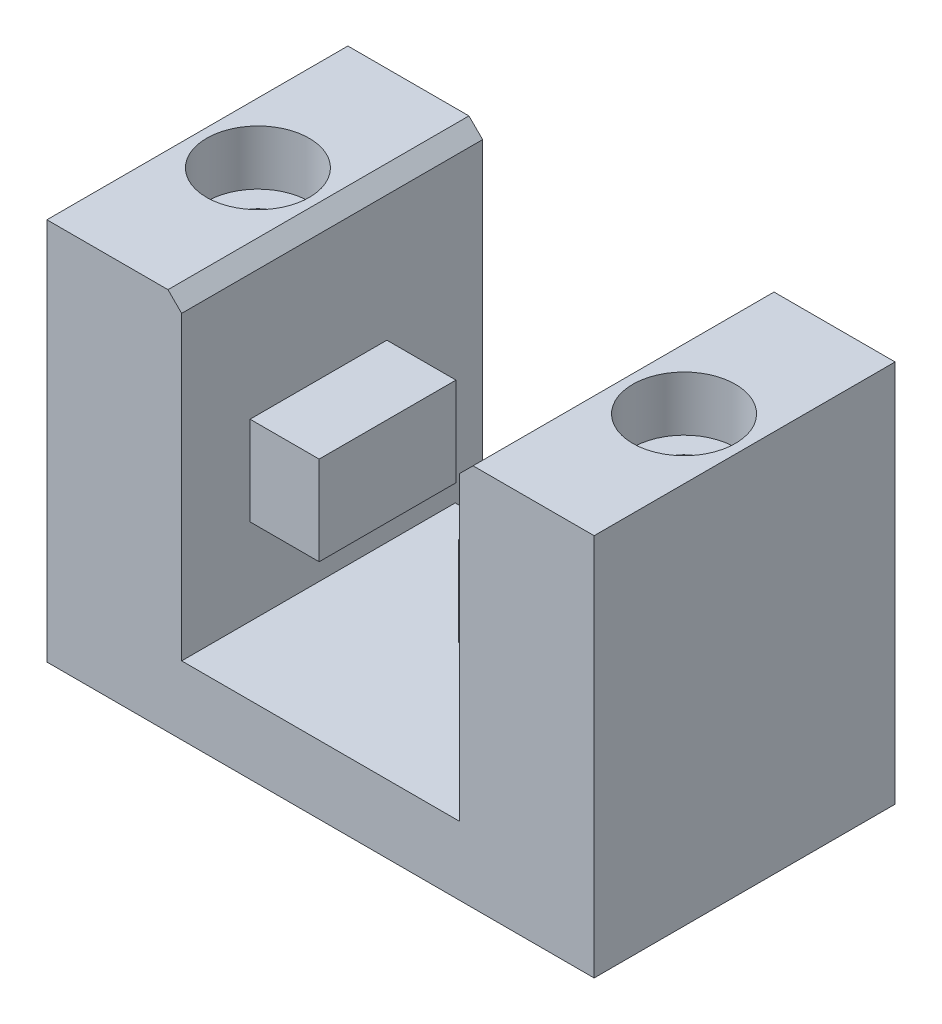
ISO-10303-21;
HEADER;
FILE_DESCRIPTION(('STEP AP214'),'2;1');
FILE_NAME('part.step','',(''),(''),'','','');
FILE_SCHEMA(('AUTOMOTIVE_DESIGN { 1 0 10303 214 1 1 1 1 }'));
ENDSEC;
DATA;
#1=APPLICATION_CONTEXT('core data for automotive mechanical design processes');
#2=APPLICATION_PROTOCOL_DEFINITION('international standard','automotive_design',2000,#1);
#3=PRODUCT_CONTEXT('',#1,'mechanical');
#4=PRODUCT('Part','Part','',(#3));
#5=PRODUCT_RELATED_PRODUCT_CATEGORY('part','',(#4));
#6=PRODUCT_DEFINITION_FORMATION('','',#4);
#7=PRODUCT_DEFINITION_CONTEXT('part definition',#1,'design');
#8=PRODUCT_DEFINITION('design','',#6,#7);
#9=PRODUCT_DEFINITION_SHAPE('','',#8);
#10=(LENGTH_UNIT() NAMED_UNIT(*) SI_UNIT(.MILLI.,.METRE.));
#11=(NAMED_UNIT(*) PLANE_ANGLE_UNIT() SI_UNIT($,.RADIAN.));
#12=(NAMED_UNIT(*) SI_UNIT($,.STERADIAN.) SOLID_ANGLE_UNIT());
#13=UNCERTAINTY_MEASURE_WITH_UNIT(LENGTH_MEASURE(1.E-05),#10,'distance_accuracy_value','');
#14=(GEOMETRIC_REPRESENTATION_CONTEXT(3) GLOBAL_UNCERTAINTY_ASSIGNED_CONTEXT((#13)) GLOBAL_UNIT_ASSIGNED_CONTEXT((#10,
#11,#12)) REPRESENTATION_CONTEXT('',''));
#15=CARTESIAN_POINT('',(0.,0.,0.));
#16=DIRECTION('',(0.,0.,1.));
#17=DIRECTION('',(1.,0.,0.));
#18=AXIS2_PLACEMENT_3D('',#15,#16,#17);
#19=CARTESIAN_POINT('',(35.575,-28.,11.));
#20=DIRECTION('',(0.,1.,0.));
#21=DIRECTION('',(0.,0.,1.));
#22=AXIS2_PLACEMENT_3D('',#19,#20,#21);
#23=CYLINDRICAL_SURFACE('',#22,2.);
#24=CARTESIAN_POINT('',(35.575,-28.,11.));
#25=DIRECTION('',(0.,1.,0.));
#26=DIRECTION('',(0.,0.,1.));
#27=AXIS2_PLACEMENT_3D('',#24,#25,#26);
#28=CIRCLE('',#27,2.);
#29=CARTESIAN_POINT('',(35.575,-28.,13.));
#30=VERTEX_POINT('',#29);
#31=EDGE_CURVE('E238',#30,#30,#28,.T.);
#32=ORIENTED_EDGE('',*,*,#31,.F.);
#33=EDGE_LOOP('',(#32));
#34=FACE_BOUND('',#33,.T.);
#35=CARTESIAN_POINT('',(35.575,-4.,11.));
#36=DIRECTION('',(0.,1.,0.));
#37=DIRECTION('',(0.,0.,1.));
#38=AXIS2_PLACEMENT_3D('',#35,#36,#37);
#39=CIRCLE('',#38,2.);
#40=CARTESIAN_POINT('',(35.575,-4.,13.));
#41=VERTEX_POINT('',#40);
#42=EDGE_CURVE('E234',#41,#41,#39,.F.);
#43=ORIENTED_EDGE('',*,*,#42,.F.);
#44=EDGE_LOOP('',(#43));
#45=FACE_BOUND('',#44,.T.);
#46=ADVANCED_FACE('F15',(#34,#45),#23,.F.);
#47=CARTESIAN_POINT('',(4.425,-28.,11.));
#48=DIRECTION('',(0.,1.,0.));
#49=DIRECTION('',(0.,0.,1.));
#50=AXIS2_PLACEMENT_3D('',#47,#48,#49);
#51=CYLINDRICAL_SURFACE('',#50,2.);
#52=CARTESIAN_POINT('',(4.425,-28.,11.));
#53=DIRECTION('',(0.,1.,0.));
#54=DIRECTION('',(0.,0.,1.));
#55=AXIS2_PLACEMENT_3D('',#52,#53,#54);
#56=CIRCLE('',#55,2.);
#57=CARTESIAN_POINT('',(4.425,-28.,13.));
#58=VERTEX_POINT('',#57);
#59=EDGE_CURVE('E363',#58,#58,#56,.T.);
#60=ORIENTED_EDGE('',*,*,#59,.F.);
#61=EDGE_LOOP('',(#60));
#62=FACE_BOUND('',#61,.T.);
#63=CARTESIAN_POINT('',(4.425,-4.,11.));
#64=DIRECTION('',(0.,1.,0.));
#65=DIRECTION('',(0.,0.,1.));
#66=AXIS2_PLACEMENT_3D('',#63,#64,#65);
#67=CIRCLE('',#66,2.);
#68=CARTESIAN_POINT('',(4.425,-4.,13.));
#69=VERTEX_POINT('',#68);
#70=EDGE_CURVE('E231',#69,#69,#67,.F.);
#71=ORIENTED_EDGE('',*,*,#70,.F.);
#72=EDGE_LOOP('',(#71));
#73=FACE_BOUND('',#72,.T.);
#74=ADVANCED_FACE('F439',(#62,#73),#51,.F.);
#75=CARTESIAN_POINT('',(9.85,0.,22.));
#76=DIRECTION('',(0.,-1.,0.));
#77=DIRECTION('',(0.,0.,-1.));
#78=AXIS2_PLACEMENT_3D('',#75,#76,#77);
#79=PLANE('',#78);
#80=CARTESIAN_POINT('',(4.425,0.,11.));
#81=DIRECTION('',(0.,1.,0.));
#82=DIRECTION('',(0.,0.,1.));
#83=AXIS2_PLACEMENT_3D('',#80,#81,#82);
#84=CIRCLE('',#83,3.75);
#85=CARTESIAN_POINT('',(4.425,0.,14.75));
#86=VERTEX_POINT('',#85);
#87=EDGE_CURVE('E505',#86,#86,#84,.T.);
#88=ORIENTED_EDGE('',*,*,#87,.F.);
#89=EDGE_LOOP('',(#88));
#90=FACE_BOUND('',#89,.T.);
#91=DIRECTION('',(-1.,0.,0.));
#92=VECTOR('',#91,1.);
#93=CARTESIAN_POINT('',(9.85,0.,22.));
#94=LINE('',#93,#92);
#95=CARTESIAN_POINT('',(8.85,0.,22.));
#96=VERTEX_POINT('',#95);
#97=CARTESIAN_POINT('',(0.,0.,22.));
#98=VERTEX_POINT('',#97);
#99=EDGE_CURVE('E302',#96,#98,#94,.T.);
#100=ORIENTED_EDGE('',*,*,#99,.F.);
#101=DIRECTION('',(0.,0.,-1.));
#102=VECTOR('',#101,1.);
#103=CARTESIAN_POINT('',(8.85,0.,22.));
#104=LINE('',#103,#102);
#105=CARTESIAN_POINT('',(8.85,0.,0.));
#106=VERTEX_POINT('',#105);
#107=EDGE_CURVE('E225',#96,#106,#104,.T.);
#108=ORIENTED_EDGE('',*,*,#107,.T.);
#109=DIRECTION('',(-1.,0.,0.));
#110=VECTOR('',#109,1.);
#111=CARTESIAN_POINT('',(9.85,0.,0.));
#112=LINE('',#111,#110);
#113=CARTESIAN_POINT('',(0.,0.,0.));
#114=VERTEX_POINT('',#113);
#115=EDGE_CURVE('E350',#106,#114,#112,.T.);
#116=ORIENTED_EDGE('',*,*,#115,.T.);
#117=DIRECTION('',(0.,0.,-1.));
#118=VECTOR('',#117,1.);
#119=CARTESIAN_POINT('',(0.,0.,22.));
#120=LINE('',#119,#118);
#121=EDGE_CURVE('E210',#98,#114,#120,.T.);
#122=ORIENTED_EDGE('',*,*,#121,.F.);
#123=EDGE_LOOP('',(#100,#108,#116,#122));
#124=FACE_BOUND('',#123,.T.);
#125=ADVANCED_FACE('F416',(#90,#124),#79,.F.);
#126=CARTESIAN_POINT('',(0.,0.,22.));
#127=DIRECTION('',(1.,0.,0.));
#128=DIRECTION('',(0.,1.,0.));
#129=AXIS2_PLACEMENT_3D('',#126,#127,#128);
#130=PLANE('',#129);
#131=DIRECTION('',(0.,-1.,0.));
#132=VECTOR('',#131,1.);
#133=CARTESIAN_POINT('',(0.,0.,0.));
#134=LINE('',#133,#132);
#135=CARTESIAN_POINT('',(0.,-28.,0.));
#136=VERTEX_POINT('',#135);
#137=EDGE_CURVE('E383',#114,#136,#134,.T.);
#138=ORIENTED_EDGE('',*,*,#137,.T.);
#139=DIRECTION('',(0.,0.,-1.));
#140=VECTOR('',#139,1.);
#141=CARTESIAN_POINT('',(0.,-28.,22.));
#142=LINE('',#141,#140);
#143=CARTESIAN_POINT('',(0.,-28.,22.));
#144=VERTEX_POINT('',#143);
#145=EDGE_CURVE('E207',#144,#136,#142,.T.);
#146=ORIENTED_EDGE('',*,*,#145,.F.);
#147=DIRECTION('',(0.,-1.,0.));
#148=VECTOR('',#147,1.);
#149=CARTESIAN_POINT('',(0.,0.,22.));
#150=LINE('',#149,#148);
#151=EDGE_CURVE('E367',#98,#144,#150,.T.);
#152=ORIENTED_EDGE('',*,*,#151,.F.);
#153=ORIENTED_EDGE('',*,*,#121,.T.);
#154=EDGE_LOOP('',(#138,#146,#152,#153));
#155=FACE_BOUND('',#154,.T.);
#156=ADVANCED_FACE('F420',(#155),#130,.F.);
#157=CARTESIAN_POINT('',(0.,-28.,22.));
#158=DIRECTION('',(0.,1.,0.));
#159=DIRECTION('',(0.,0.,1.));
#160=AXIS2_PLACEMENT_3D('',#157,#158,#159);
#161=PLANE('',#160);
#162=ORIENTED_EDGE('',*,*,#59,.T.);
#163=EDGE_LOOP('',(#162));
#164=FACE_BOUND('',#163,.T.);
#165=ORIENTED_EDGE('',*,*,#31,.T.);
#166=EDGE_LOOP('',(#165));
#167=FACE_BOUND('',#166,.T.);
#168=DIRECTION('',(1.,0.,0.));
#169=VECTOR('',#168,1.);
#170=CARTESIAN_POINT('',(0.,-28.,0.));
#171=LINE('',#170,#169);
#172=CARTESIAN_POINT('',(40.,-28.,0.));
#173=VERTEX_POINT('',#172);
#174=EDGE_CURVE('E385',#136,#173,#171,.T.);
#175=ORIENTED_EDGE('',*,*,#174,.T.);
#176=DIRECTION('',(0.,0.,-1.));
#177=VECTOR('',#176,1.);
#178=CARTESIAN_POINT('',(40.,-28.,22.));
#179=LINE('',#178,#177);
#180=CARTESIAN_POINT('',(40.,-28.,22.));
#181=VERTEX_POINT('',#180);
#182=EDGE_CURVE('E199',#181,#173,#179,.T.);
#183=ORIENTED_EDGE('',*,*,#182,.F.);
#184=DIRECTION('',(1.,0.,0.));
#185=VECTOR('',#184,1.);
#186=CARTESIAN_POINT('',(0.,-28.,22.));
#187=LINE('',#186,#185);
#188=EDGE_CURVE('E369',#144,#181,#187,.T.);
#189=ORIENTED_EDGE('',*,*,#188,.F.);
#190=ORIENTED_EDGE('',*,*,#145,.T.);
#191=EDGE_LOOP('',(#175,#183,#189,#190));
#192=FACE_BOUND('',#191,.T.);
#193=ADVANCED_FACE('F424',(#164,#167,#192),#161,.F.);
#194=CARTESIAN_POINT('',(40.,-28.,22.));
#195=DIRECTION('',(-1.,0.,0.));
#196=DIRECTION('',(0.,0.,1.));
#197=AXIS2_PLACEMENT_3D('',#194,#195,#196);
#198=PLANE('',#197);
#199=DIRECTION('',(0.,1.,0.));
#200=VECTOR('',#199,1.);
#201=CARTESIAN_POINT('',(40.,-28.,0.));
#202=LINE('',#201,#200);
#203=CARTESIAN_POINT('',(40.,0.,0.));
#204=VERTEX_POINT('',#203);
#205=EDGE_CURVE('E304',#173,#204,#202,.T.);
#206=ORIENTED_EDGE('',*,*,#205,.T.);
#207=DIRECTION('',(0.,0.,-1.));
#208=VECTOR('',#207,1.);
#209=CARTESIAN_POINT('',(40.,0.,22.));
#210=LINE('',#209,#208);
#211=CARTESIAN_POINT('',(40.,0.,22.));
#212=VERTEX_POINT('',#211);
#213=EDGE_CURVE('E196',#212,#204,#210,.T.);
#214=ORIENTED_EDGE('',*,*,#213,.F.);
#215=DIRECTION('',(0.,1.,0.));
#216=VECTOR('',#215,1.);
#217=CARTESIAN_POINT('',(40.,-28.,22.));
#218=LINE('',#217,#216);
#219=EDGE_CURVE('E371',#181,#212,#218,.T.);
#220=ORIENTED_EDGE('',*,*,#219,.F.);
#221=ORIENTED_EDGE('',*,*,#182,.T.);
#222=EDGE_LOOP('',(#206,#214,#220,#221));
#223=FACE_BOUND('',#222,.T.);
#224=ADVANCED_FACE('F389',(#223),#198,.F.);
#225=CARTESIAN_POINT('',(40.,0.,22.));
#226=DIRECTION('',(0.,-1.,0.));
#227=DIRECTION('',(0.,0.,-1.));
#228=AXIS2_PLACEMENT_3D('',#225,#226,#227);
#229=PLANE('',#228);
#230=CARTESIAN_POINT('',(35.575,0.,11.));
#231=DIRECTION('',(0.,1.,0.));
#232=DIRECTION('',(0.,0.,1.));
#233=AXIS2_PLACEMENT_3D('',#230,#231,#232);
#234=CIRCLE('',#233,3.75);
#235=CARTESIAN_POINT('',(35.575,0.,14.75));
#236=VERTEX_POINT('',#235);
#237=EDGE_CURVE('E278',#236,#236,#234,.T.);
#238=ORIENTED_EDGE('',*,*,#237,.F.);
#239=EDGE_LOOP('',(#238));
#240=FACE_BOUND('',#239,.T.);
#241=DIRECTION('',(-1.,0.,0.));
#242=VECTOR('',#241,1.);
#243=CARTESIAN_POINT('',(40.,0.,0.));
#244=LINE('',#243,#242);
#245=CARTESIAN_POINT('',(31.15,0.,0.));
#246=VERTEX_POINT('',#245);
#247=EDGE_CURVE('E300',#204,#246,#244,.T.);
#248=ORIENTED_EDGE('',*,*,#247,.T.);
#249=DIRECTION('',(0.,0.,1.));
#250=VECTOR('',#249,1.);
#251=CARTESIAN_POINT('',(31.15,0.,22.));
#252=LINE('',#251,#250);
#253=CARTESIAN_POINT('',(31.15,0.,22.));
#254=VERTEX_POINT('',#253);
#255=EDGE_CURVE('E219',#246,#254,#252,.T.);
#256=ORIENTED_EDGE('',*,*,#255,.T.);
#257=DIRECTION('',(-1.,0.,0.));
#258=VECTOR('',#257,1.);
#259=CARTESIAN_POINT('',(40.,0.,22.));
#260=LINE('',#259,#258);
#261=EDGE_CURVE('E373',#212,#254,#260,.T.);
#262=ORIENTED_EDGE('',*,*,#261,.F.);
#263=ORIENTED_EDGE('',*,*,#213,.T.);
#264=EDGE_LOOP('',(#248,#256,#262,#263));
#265=FACE_BOUND('',#264,.T.);
#266=ADVANCED_FACE('F395',(#240,#265),#229,.F.);
#267=CARTESIAN_POINT('',(30.15,-10.2,22.));
#268=DIRECTION('',(0.,-1.,0.));
#269=DIRECTION('',(0.,0.,-1.));
#270=AXIS2_PLACEMENT_3D('',#267,#268,#269);
#271=PLANE('',#270);
#272=DIRECTION('',(0.,0.,-1.));
#273=VECTOR('',#272,1.);
#274=CARTESIAN_POINT('',(30.15,-10.2,22.));
#275=LINE('',#274,#273);
#276=CARTESIAN_POINT('',(30.15,-10.2,17.));
#277=VERTEX_POINT('',#276);
#278=CARTESIAN_POINT('',(30.15,-10.2,7.));
#279=VERTEX_POINT('',#278);
#280=EDGE_CURVE('E186',#277,#279,#275,.T.);
#281=ORIENTED_EDGE('',*,*,#280,.T.);
#282=DIRECTION('',(-1.,0.,0.));
#283=VECTOR('',#282,1.);
#284=CARTESIAN_POINT('',(30.15,-10.2,7.));
#285=LINE('',#284,#283);
#286=CARTESIAN_POINT('',(25.1,-10.2,7.));
#287=VERTEX_POINT('',#286);
#288=EDGE_CURVE('E260',#279,#287,#285,.T.);
#289=ORIENTED_EDGE('',*,*,#288,.T.);
#290=DIRECTION('',(0.,0.,-1.));
#291=VECTOR('',#290,1.);
#292=CARTESIAN_POINT('',(25.1,-10.2,22.));
#293=LINE('',#292,#291);
#294=CARTESIAN_POINT('',(25.1,-10.2,17.));
#295=VERTEX_POINT('',#294);
#296=EDGE_CURVE('E189',#295,#287,#293,.T.);
#297=ORIENTED_EDGE('',*,*,#296,.F.);
#298=DIRECTION('',(-1.,0.,0.));
#299=VECTOR('',#298,1.);
#300=CARTESIAN_POINT('',(25.1,-10.2,17.));
#301=LINE('',#300,#299);
#302=EDGE_CURVE('E172',#277,#295,#301,.T.);
#303=ORIENTED_EDGE('',*,*,#302,.F.);
#304=EDGE_LOOP('',(#281,#289,#297,#303));
#305=FACE_BOUND('',#304,.T.);
#306=ADVANCED_FACE('F185',(#305),#271,.F.);
#307=CARTESIAN_POINT('',(25.1,-10.2,22.));
#308=DIRECTION('',(1.,0.,0.));
#309=DIRECTION('',(0.,0.,-1.));
#310=AXIS2_PLACEMENT_3D('',#307,#308,#309);
#311=PLANE('',#310);
#312=ORIENTED_EDGE('',*,*,#296,.T.);
#313=DIRECTION('',(0.,-1.,0.));
#314=VECTOR('',#313,1.);
#315=CARTESIAN_POINT('',(25.1,-10.2,7.));
#316=LINE('',#315,#314);
#317=CARTESIAN_POINT('',(25.1,-16.7,7.));
#318=VERTEX_POINT('',#317);
#319=EDGE_CURVE('E262',#287,#318,#316,.T.);
#320=ORIENTED_EDGE('',*,*,#319,.T.);
#321=DIRECTION('',(0.,0.,-1.));
#322=VECTOR('',#321,1.);
#323=CARTESIAN_POINT('',(25.1,-16.7,22.));
#324=LINE('',#323,#322);
#325=CARTESIAN_POINT('',(25.1,-16.7,17.));
#326=VERTEX_POINT('',#325);
#327=EDGE_CURVE('E201',#326,#318,#324,.T.);
#328=ORIENTED_EDGE('',*,*,#327,.F.);
#329=DIRECTION('',(0.,1.,0.));
#330=VECTOR('',#329,1.);
#331=CARTESIAN_POINT('',(25.1,-23.8065110989852,17.));
#332=LINE('',#331,#330);
#333=EDGE_CURVE('E180',#326,#295,#332,.T.);
#334=ORIENTED_EDGE('',*,*,#333,.T.);
#335=EDGE_LOOP('',(#312,#320,#328,#334));
#336=FACE_BOUND('',#335,.T.);
#337=ADVANCED_FACE('F489',(#336),#311,.F.);
#338=CARTESIAN_POINT('',(25.1,-16.7,22.));
#339=DIRECTION('',(0.,1.,0.));
#340=DIRECTION('',(0.,0.,1.));
#341=AXIS2_PLACEMENT_3D('',#338,#339,#340);
#342=PLANE('',#341);
#343=ORIENTED_EDGE('',*,*,#327,.T.);
#344=DIRECTION('',(1.,0.,0.));
#345=VECTOR('',#344,1.);
#346=CARTESIAN_POINT('',(25.1,-16.7,7.));
#347=LINE('',#346,#345);
#348=CARTESIAN_POINT('',(30.15,-16.7,7.));
#349=VERTEX_POINT('',#348);
#350=EDGE_CURVE('E258',#318,#349,#347,.T.);
#351=ORIENTED_EDGE('',*,*,#350,.T.);
#352=DIRECTION('',(0.,0.,-1.));
#353=VECTOR('',#352,1.);
#354=CARTESIAN_POINT('',(30.15,-16.7,22.));
#355=LINE('',#354,#353);
#356=CARTESIAN_POINT('',(30.15,-16.7,17.));
#357=VERTEX_POINT('',#356);
#358=EDGE_CURVE('E325',#357,#349,#355,.T.);
#359=ORIENTED_EDGE('',*,*,#358,.F.);
#360=DIRECTION('',(1.,0.,0.));
#361=VECTOR('',#360,1.);
#362=CARTESIAN_POINT('',(25.1,-16.7,17.));
#363=LINE('',#362,#361);
#364=EDGE_CURVE('E175',#326,#357,#363,.T.);
#365=ORIENTED_EDGE('',*,*,#364,.F.);
#366=EDGE_LOOP('',(#343,#351,#359,#365));
#367=FACE_BOUND('',#366,.T.);
#368=ADVANCED_FACE('F330',(#367),#342,.F.);
#369=CARTESIAN_POINT('',(30.15,-16.7,22.));
#370=DIRECTION('',(1.,0.,0.));
#371=DIRECTION('',(0.,0.,-1.));
#372=AXIS2_PLACEMENT_3D('',#369,#370,#371);
#373=PLANE('',#372);
#374=ORIENTED_EDGE('',*,*,#280,.F.);
#375=DIRECTION('',(0.,1.,0.));
#376=VECTOR('',#375,1.);
#377=CARTESIAN_POINT('',(30.15,-23.8065110989852,17.));
#378=LINE('',#377,#376);
#379=EDGE_CURVE('E169',#357,#277,#378,.T.);
#380=ORIENTED_EDGE('',*,*,#379,.F.);
#381=ORIENTED_EDGE('',*,*,#358,.T.);
#382=DIRECTION('',(0.,-0.707106781186546,0.707106781186549));
#383=VECTOR('',#382,1.);
#384=CARTESIAN_POINT('',(30.15,-24.2,14.5));
#385=LINE('',#384,#383);
#386=CARTESIAN_POINT('',(30.15,-14.7,5.));
#387=VERTEX_POINT('',#386);
#388=EDGE_CURVE('E268',#349,#387,#385,.F.);
#389=ORIENTED_EDGE('',*,*,#388,.T.);
#390=DIRECTION('',(0.,1.,0.));
#391=VECTOR('',#390,1.);
#392=CARTESIAN_POINT('',(30.15,-23.8065110989852,5.));
#393=LINE('',#392,#391);
#394=CARTESIAN_POINT('',(30.15,-12.2,5.));
#395=VERTEX_POINT('',#394);
#396=EDGE_CURVE('E346',#387,#395,#393,.T.);
#397=ORIENTED_EDGE('',*,*,#396,.T.);
#398=DIRECTION('',(0.,-0.707106781186546,-0.707106781186549));
#399=VECTOR('',#398,1.);
#400=CARTESIAN_POINT('',(30.15,-5.95,11.25));
#401=LINE('',#400,#399);
#402=EDGE_CURVE('E195',#395,#279,#401,.F.);
#403=ORIENTED_EDGE('',*,*,#402,.T.);
#404=EDGE_LOOP('',(#374,#380,#381,#389,#397,#403));
#405=FACE_BOUND('',#404,.T.);
#406=DIRECTION('',(0.,-1.,0.));
#407=VECTOR('',#406,1.);
#408=CARTESIAN_POINT('',(30.15,0.,22.));
#409=LINE('',#408,#407);
#410=CARTESIAN_POINT('',(30.15,-1.,22.));
#411=VERTEX_POINT('',#410);
#412=CARTESIAN_POINT('',(30.15,-23.,22.));
#413=VERTEX_POINT('',#412);
#414=EDGE_CURVE('E376',#411,#413,#409,.T.);
#415=ORIENTED_EDGE('',*,*,#414,.F.);
#416=DIRECTION('',(0.,0.,-1.));
#417=VECTOR('',#416,1.);
#418=CARTESIAN_POINT('',(30.15,-1.,22.));
#419=LINE('',#418,#417);
#420=CARTESIAN_POINT('',(30.15,-1.,0.));
#421=VERTEX_POINT('',#420);
#422=EDGE_CURVE('E213',#411,#421,#419,.T.);
#423=ORIENTED_EDGE('',*,*,#422,.T.);
#424=DIRECTION('',(0.,-1.,0.));
#425=VECTOR('',#424,1.);
#426=CARTESIAN_POINT('',(30.15,-16.7,0.));
#427=LINE('',#426,#425);
#428=CARTESIAN_POINT('',(30.15,-25.,0.));
#429=VERTEX_POINT('',#428);
#430=EDGE_CURVE('E37',#421,#429,#427,.T.);
#431=ORIENTED_EDGE('',*,*,#430,.T.);
#432=DIRECTION('',(0.,-0.707106781186549,-0.707106781186547));
#433=VECTOR('',#432,1.);
#434=CARTESIAN_POINT('',(30.15,-9.85,15.15));
#435=LINE('',#434,#433);
#436=CARTESIAN_POINT('',(30.15,-23.,2.));
#437=VERTEX_POINT('',#436);
#438=EDGE_CURVE('E9',#429,#437,#435,.F.);
#439=ORIENTED_EDGE('',*,*,#438,.T.);
#440=DIRECTION('',(0.,0.,-1.));
#441=VECTOR('',#440,1.);
#442=CARTESIAN_POINT('',(30.15,-23.,22.));
#443=LINE('',#442,#441);
#444=EDGE_CURVE('E322',#413,#437,#443,.T.);
#445=ORIENTED_EDGE('',*,*,#444,.F.);
#446=EDGE_LOOP('',(#415,#423,#431,#439,#445));
#447=FACE_BOUND('',#446,.T.);
#448=ADVANCED_FACE('F192',(#405,#447),#373,.F.);
#449=CARTESIAN_POINT('',(30.15,-23.,22.));
#450=DIRECTION('',(0.,-1.,0.));
#451=DIRECTION('',(1.,0.,0.));
#452=AXIS2_PLACEMENT_3D('',#449,#450,#451);
#453=PLANE('',#452);
#454=ORIENTED_EDGE('',*,*,#444,.T.);
#455=DIRECTION('',(-1.,0.,0.));
#456=VECTOR('',#455,1.);
#457=CARTESIAN_POINT('',(30.15,-23.,2.));
#458=LINE('',#457,#456);
#459=CARTESIAN_POINT('',(9.85,-23.,2.));
#460=VERTEX_POINT('',#459);
#461=EDGE_CURVE('E271',#437,#460,#458,.T.);
#462=ORIENTED_EDGE('',*,*,#461,.T.);
#463=DIRECTION('',(0.,0.,-1.));
#464=VECTOR('',#463,1.);
#465=CARTESIAN_POINT('',(9.85,-23.,22.));
#466=LINE('',#465,#464);
#467=CARTESIAN_POINT('',(9.85,-23.,22.));
#468=VERTEX_POINT('',#467);
#469=EDGE_CURVE('E293',#468,#460,#466,.T.);
#470=ORIENTED_EDGE('',*,*,#469,.F.);
#471=DIRECTION('',(-1.,0.,0.));
#472=VECTOR('',#471,1.);
#473=CARTESIAN_POINT('',(30.15,-23.,22.));
#474=LINE('',#473,#472);
#475=EDGE_CURVE('E378',#413,#468,#474,.T.);
#476=ORIENTED_EDGE('',*,*,#475,.F.);
#477=EDGE_LOOP('',(#454,#462,#470,#476));
#478=FACE_BOUND('',#477,.T.);
#479=ADVANCED_FACE('F408',(#478),#453,.F.);
#480=CARTESIAN_POINT('',(9.85,-16.7,22.));
#481=DIRECTION('',(0.,1.,0.));
#482=DIRECTION('',(0.,0.,1.));
#483=AXIS2_PLACEMENT_3D('',#480,#481,#482);
#484=PLANE('',#483);
#485=DIRECTION('',(0.,0.,-1.));
#486=VECTOR('',#485,1.);
#487=CARTESIAN_POINT('',(9.85,-16.7,22.));
#488=LINE('',#487,#486);
#489=CARTESIAN_POINT('',(9.85,-16.7,17.));
#490=VERTEX_POINT('',#489);
#491=CARTESIAN_POINT('',(9.85,-16.7,7.));
#492=VERTEX_POINT('',#491);
#493=EDGE_CURVE('E318',#490,#492,#488,.T.);
#494=ORIENTED_EDGE('',*,*,#493,.T.);
#495=DIRECTION('',(1.,0.,0.));
#496=VECTOR('',#495,1.);
#497=CARTESIAN_POINT('',(9.85,-16.7,7.));
#498=LINE('',#497,#496);
#499=CARTESIAN_POINT('',(14.9,-16.7,7.));
#500=VERTEX_POINT('',#499);
#501=EDGE_CURVE('E249',#492,#500,#498,.T.);
#502=ORIENTED_EDGE('',*,*,#501,.T.);
#503=DIRECTION('',(0.,0.,-1.));
#504=VECTOR('',#503,1.);
#505=CARTESIAN_POINT('',(14.9,-16.7,22.));
#506=LINE('',#505,#504);
#507=CARTESIAN_POINT('',(14.9,-16.7,17.));
#508=VERTEX_POINT('',#507);
#509=EDGE_CURVE('E315',#508,#500,#506,.T.);
#510=ORIENTED_EDGE('',*,*,#509,.F.);
#511=DIRECTION('',(1.,0.,0.));
#512=VECTOR('',#511,1.);
#513=CARTESIAN_POINT('',(9.85,-16.7,17.));
#514=LINE('',#513,#512);
#515=EDGE_CURVE('E190',#490,#508,#514,.T.);
#516=ORIENTED_EDGE('',*,*,#515,.F.);
#517=EDGE_LOOP('',(#494,#502,#510,#516));
#518=FACE_BOUND('',#517,.T.);
#519=ADVANCED_FACE('F478',(#518),#484,.F.);
#520=CARTESIAN_POINT('',(14.9,-16.7,22.));
#521=DIRECTION('',(-1.,0.,0.));
#522=DIRECTION('',(0.,0.,1.));
#523=AXIS2_PLACEMENT_3D('',#520,#521,#522);
#524=PLANE('',#523);
#525=ORIENTED_EDGE('',*,*,#509,.T.);
#526=DIRECTION('',(0.,1.,0.));
#527=VECTOR('',#526,1.);
#528=CARTESIAN_POINT('',(14.9,-16.7,7.));
#529=LINE('',#528,#527);
#530=CARTESIAN_POINT('',(14.9,-10.2,7.));
#531=VERTEX_POINT('',#530);
#532=EDGE_CURVE('E247',#500,#531,#529,.T.);
#533=ORIENTED_EDGE('',*,*,#532,.T.);
#534=DIRECTION('',(0.,0.,-1.));
#535=VECTOR('',#534,1.);
#536=CARTESIAN_POINT('',(14.9,-10.2,22.));
#537=LINE('',#536,#535);
#538=CARTESIAN_POINT('',(14.9,-10.2,17.));
#539=VERTEX_POINT('',#538);
#540=EDGE_CURVE('E311',#539,#531,#537,.T.);
#541=ORIENTED_EDGE('',*,*,#540,.F.);
#542=DIRECTION('',(0.,1.,0.));
#543=VECTOR('',#542,1.);
#544=CARTESIAN_POINT('',(14.9,-23.8065110989852,17.));
#545=LINE('',#544,#543);
#546=EDGE_CURVE('E362',#508,#539,#545,.T.);
#547=ORIENTED_EDGE('',*,*,#546,.F.);
#548=EDGE_LOOP('',(#525,#533,#541,#547));
#549=FACE_BOUND('',#548,.T.);
#550=ADVANCED_FACE('F474',(#549),#524,.F.);
#551=CARTESIAN_POINT('',(14.9,-10.2,22.));
#552=DIRECTION('',(0.,-1.,0.));
#553=DIRECTION('',(0.,0.,-1.));
#554=AXIS2_PLACEMENT_3D('',#551,#552,#553);
#555=PLANE('',#554);
#556=ORIENTED_EDGE('',*,*,#540,.T.);
#557=DIRECTION('',(-1.,0.,0.));
#558=VECTOR('',#557,1.);
#559=CARTESIAN_POINT('',(14.9,-10.2,7.));
#560=LINE('',#559,#558);
#561=CARTESIAN_POINT('',(9.85,-10.2,7.));
#562=VERTEX_POINT('',#561);
#563=EDGE_CURVE('E245',#531,#562,#560,.T.);
#564=ORIENTED_EDGE('',*,*,#563,.T.);
#565=DIRECTION('',(0.,0.,-1.));
#566=VECTOR('',#565,1.);
#567=CARTESIAN_POINT('',(9.85,-10.2,22.));
#568=LINE('',#567,#566);
#569=CARTESIAN_POINT('',(9.85,-10.2,17.));
#570=VERTEX_POINT('',#569);
#571=EDGE_CURVE('E308',#570,#562,#568,.T.);
#572=ORIENTED_EDGE('',*,*,#571,.F.);
#573=DIRECTION('',(-1.,0.,0.));
#574=VECTOR('',#573,1.);
#575=CARTESIAN_POINT('',(9.85,-10.2,17.));
#576=LINE('',#575,#574);
#577=EDGE_CURVE('E359',#539,#570,#576,.T.);
#578=ORIENTED_EDGE('',*,*,#577,.F.);
#579=EDGE_LOOP('',(#556,#564,#572,#578));
#580=FACE_BOUND('',#579,.T.);
#581=ADVANCED_FACE('F470',(#580),#555,.F.);
#582=CARTESIAN_POINT('',(9.85,-10.2,22.));
#583=DIRECTION('',(-1.,0.,0.));
#584=DIRECTION('',(0.,0.,1.));
#585=AXIS2_PLACEMENT_3D('',#582,#583,#584);
#586=PLANE('',#585);
#587=ORIENTED_EDGE('',*,*,#493,.F.);
#588=DIRECTION('',(0.,1.,0.));
#589=VECTOR('',#588,1.);
#590=CARTESIAN_POINT('',(9.85,-23.8065110989852,17.));
#591=LINE('',#590,#589);
#592=EDGE_CURVE('E358',#490,#570,#591,.T.);
#593=ORIENTED_EDGE('',*,*,#592,.T.);
#594=ORIENTED_EDGE('',*,*,#571,.T.);
#595=DIRECTION('',(0.,0.707106781186546,0.707106781186549));
#596=VECTOR('',#595,1.);
#597=CARTESIAN_POINT('',(9.85,-2.7,14.5));
#598=LINE('',#597,#596);
#599=CARTESIAN_POINT('',(9.85,-12.2,5.));
#600=VERTEX_POINT('',#599);
#601=EDGE_CURVE('E264',#562,#600,#598,.F.);
#602=ORIENTED_EDGE('',*,*,#601,.T.);
#603=DIRECTION('',(0.,1.,0.));
#604=VECTOR('',#603,1.);
#605=CARTESIAN_POINT('',(9.85,-23.8065110989852,5.));
#606=LINE('',#605,#604);
#607=CARTESIAN_POINT('',(9.85,-14.7,5.));
#608=VERTEX_POINT('',#607);
#609=EDGE_CURVE('E347',#608,#600,#606,.T.);
#610=ORIENTED_EDGE('',*,*,#609,.F.);
#611=DIRECTION('',(0.,0.707106781186546,-0.707106781186549));
#612=VECTOR('',#611,1.);
#613=CARTESIAN_POINT('',(9.85,-20.95,11.25));
#614=LINE('',#613,#612);
#615=EDGE_CURVE('E266',#608,#492,#614,.F.);
#616=ORIENTED_EDGE('',*,*,#615,.T.);
#617=EDGE_LOOP('',(#587,#593,#594,#602,#610,#616));
#618=FACE_BOUND('',#617,.T.);
#619=DIRECTION('',(0.,1.,0.));
#620=VECTOR('',#619,1.);
#621=CARTESIAN_POINT('',(9.85,-10.2,0.));
#622=LINE('',#621,#620);
#623=CARTESIAN_POINT('',(9.85,-25.,0.));
#624=VERTEX_POINT('',#623);
#625=CARTESIAN_POINT('',(9.85,-1.,0.));
#626=VERTEX_POINT('',#625);
#627=EDGE_CURVE('E30',#624,#626,#622,.T.);
#628=ORIENTED_EDGE('',*,*,#627,.T.);
#629=DIRECTION('',(0.,0.,1.));
#630=VECTOR('',#629,1.);
#631=CARTESIAN_POINT('',(9.85,-1.,22.));
#632=LINE('',#631,#630);
#633=CARTESIAN_POINT('',(9.85,-1.,22.));
#634=VERTEX_POINT('',#633);
#635=EDGE_CURVE('E228',#626,#634,#632,.T.);
#636=ORIENTED_EDGE('',*,*,#635,.T.);
#637=DIRECTION('',(0.,1.,0.));
#638=VECTOR('',#637,1.);
#639=CARTESIAN_POINT('',(9.85,-23.,22.));
#640=LINE('',#639,#638);
#641=EDGE_CURVE('E312',#468,#634,#640,.T.);
#642=ORIENTED_EDGE('',*,*,#641,.F.);
#643=ORIENTED_EDGE('',*,*,#469,.T.);
#644=DIRECTION('',(0.,0.707106781186549,0.707106781186547));
#645=VECTOR('',#644,1.);
#646=CARTESIAN_POINT('',(9.85,-6.6,18.4));
#647=LINE('',#646,#645);
#648=EDGE_CURVE('E23',#460,#624,#647,.F.);
#649=ORIENTED_EDGE('',*,*,#648,.T.);
#650=EDGE_LOOP('',(#628,#636,#642,#643,#649));
#651=FACE_BOUND('',#650,.T.);
#652=ADVANCED_FACE('F289',(#618,#651),#586,.F.);
#653=CARTESIAN_POINT('',(0.,0.,22.));
#654=DIRECTION('',(0.,0.,1.));
#655=DIRECTION('',(1.,0.,0.));
#656=AXIS2_PLACEMENT_3D('',#653,#654,#655);
#657=PLANE('',#656);
#658=ORIENTED_EDGE('',*,*,#261,.T.);
#659=DIRECTION('',(0.707106781186548,0.707106781186548,0.));
#660=VECTOR('',#659,1.);
#661=CARTESIAN_POINT('',(15.575,-15.575,22.));
#662=LINE('',#661,#660);
#663=EDGE_CURVE('E223',#254,#411,#662,.F.);
#664=ORIENTED_EDGE('',*,*,#663,.T.);
#665=ORIENTED_EDGE('',*,*,#414,.T.);
#666=ORIENTED_EDGE('',*,*,#475,.T.);
#667=ORIENTED_EDGE('',*,*,#641,.T.);
#668=DIRECTION('',(0.707106781186548,-0.707106781186548,0.));
#669=VECTOR('',#668,1.);
#670=CARTESIAN_POINT('',(4.425,4.425,22.));
#671=LINE('',#670,#669);
#672=EDGE_CURVE('E221',#634,#96,#671,.F.);
#673=ORIENTED_EDGE('',*,*,#672,.T.);
#674=ORIENTED_EDGE('',*,*,#99,.T.);
#675=ORIENTED_EDGE('',*,*,#151,.T.);
#676=ORIENTED_EDGE('',*,*,#188,.T.);
#677=ORIENTED_EDGE('',*,*,#219,.T.);
#678=EDGE_LOOP('',(#658,#664,#665,#666,#667,#673,#674,#675,#676,#677));
#679=FACE_BOUND('',#678,.T.);
#680=ADVANCED_FACE('F399',(#679),#657,.T.);
#681=CARTESIAN_POINT('',(0.,0.,0.));
#682=DIRECTION('',(0.,0.,1.));
#683=DIRECTION('',(1.,0.,0.));
#684=AXIS2_PLACEMENT_3D('',#681,#682,#683);
#685=PLANE('',#684);
#686=ORIENTED_EDGE('',*,*,#627,.F.);
#687=DIRECTION('',(1.,0.,0.));
#688=VECTOR('',#687,1.);
#689=CARTESIAN_POINT('',(0.,-25.,0.));
#690=LINE('',#689,#688);
#691=EDGE_CURVE('E285',#624,#429,#690,.T.);
#692=ORIENTED_EDGE('',*,*,#691,.T.);
#693=ORIENTED_EDGE('',*,*,#430,.F.);
#694=DIRECTION('',(-0.707106781186548,-0.707106781186548,0.));
#695=VECTOR('',#694,1.);
#696=CARTESIAN_POINT('',(30.15,-1.,0.));
#697=LINE('',#696,#695);
#698=EDGE_CURVE('E217',#421,#246,#697,.F.);
#699=ORIENTED_EDGE('',*,*,#698,.T.);
#700=ORIENTED_EDGE('',*,*,#247,.F.);
#701=ORIENTED_EDGE('',*,*,#205,.F.);
#702=ORIENTED_EDGE('',*,*,#174,.F.);
#703=ORIENTED_EDGE('',*,*,#137,.F.);
#704=ORIENTED_EDGE('',*,*,#115,.F.);
#705=DIRECTION('',(-0.707106781186548,0.707106781186548,0.));
#706=VECTOR('',#705,1.);
#707=CARTESIAN_POINT('',(8.85,0.,0.));
#708=LINE('',#707,#706);
#709=EDGE_CURVE('E215',#106,#626,#708,.F.);
#710=ORIENTED_EDGE('',*,*,#709,.T.);
#711=EDGE_LOOP('',(#686,#692,#693,#699,#700,#701,#702,#703,#704,#710));
#712=FACE_BOUND('',#711,.T.);
#713=ADVANCED_FACE('F297',(#712),#685,.F.);
#714=CARTESIAN_POINT('',(9.85,-23.8065110989852,5.));
#715=DIRECTION('',(0.,0.,1.));
#716=DIRECTION('',(1.,0.,0.));
#717=AXIS2_PLACEMENT_3D('',#714,#715,#716);
#718=PLANE('',#717);
#719=ORIENTED_EDGE('',*,*,#609,.T.);
#720=DIRECTION('',(1.,0.,0.));
#721=VECTOR('',#720,1.);
#722=CARTESIAN_POINT('',(9.85,-12.2,5.));
#723=LINE('',#722,#721);
#724=CARTESIAN_POINT('',(12.9,-12.2,5.));
#725=VERTEX_POINT('',#724);
#726=EDGE_CURVE('E242',#600,#725,#723,.T.);
#727=ORIENTED_EDGE('',*,*,#726,.T.);
#728=DIRECTION('',(0.,-1.,0.));
#729=VECTOR('',#728,1.);
#730=CARTESIAN_POINT('',(12.9,-23.8065110989852,5.));
#731=LINE('',#730,#729);
#732=CARTESIAN_POINT('',(12.9,-14.7,5.));
#733=VERTEX_POINT('',#732);
#734=EDGE_CURVE('E240',#725,#733,#731,.T.);
#735=ORIENTED_EDGE('',*,*,#734,.T.);
#736=DIRECTION('',(-1.,0.,0.));
#737=VECTOR('',#736,1.);
#738=CARTESIAN_POINT('',(9.85,-14.7,5.));
#739=LINE('',#738,#737);
#740=EDGE_CURVE('E230',#733,#608,#739,.T.);
#741=ORIENTED_EDGE('',*,*,#740,.T.);
#742=EDGE_LOOP('',(#719,#727,#735,#741));
#743=FACE_BOUND('',#742,.T.);
#744=ADVANCED_FACE('F454',(#743),#718,.F.);
#745=CARTESIAN_POINT('',(25.1,-23.8065110989852,5.));
#746=DIRECTION('',(0.,0.,1.));
#747=DIRECTION('',(1.,0.,0.));
#748=AXIS2_PLACEMENT_3D('',#745,#746,#747);
#749=PLANE('',#748);
#750=ORIENTED_EDGE('',*,*,#396,.F.);
#751=DIRECTION('',(-1.,0.,0.));
#752=VECTOR('',#751,1.);
#753=CARTESIAN_POINT('',(25.1,-14.7,5.));
#754=LINE('',#753,#752);
#755=CARTESIAN_POINT('',(27.1,-14.7,5.));
#756=VERTEX_POINT('',#755);
#757=EDGE_CURVE('E255',#387,#756,#754,.T.);
#758=ORIENTED_EDGE('',*,*,#757,.T.);
#759=DIRECTION('',(0.,1.,0.));
#760=VECTOR('',#759,1.);
#761=CARTESIAN_POINT('',(27.1,-23.8065110989852,5.));
#762=LINE('',#761,#760);
#763=CARTESIAN_POINT('',(27.1,-12.2,5.));
#764=VERTEX_POINT('',#763);
#765=EDGE_CURVE('E251',#756,#764,#762,.T.);
#766=ORIENTED_EDGE('',*,*,#765,.T.);
#767=DIRECTION('',(1.,0.,0.));
#768=VECTOR('',#767,1.);
#769=CARTESIAN_POINT('',(25.1,-12.2,5.));
#770=LINE('',#769,#768);
#771=EDGE_CURVE('E253',#764,#395,#770,.T.);
#772=ORIENTED_EDGE('',*,*,#771,.T.);
#773=EDGE_LOOP('',(#750,#758,#766,#772));
#774=FACE_BOUND('',#773,.T.);
#775=ADVANCED_FACE('F345',(#774),#749,.F.);
#776=CARTESIAN_POINT('',(25.1,-23.8065110989852,17.));
#777=DIRECTION('',(0.,0.,-1.));
#778=DIRECTION('',(-1.,0.,0.));
#779=AXIS2_PLACEMENT_3D('',#776,#777,#778);
#780=PLANE('',#779);
#781=ORIENTED_EDGE('',*,*,#364,.T.);
#782=ORIENTED_EDGE('',*,*,#379,.T.);
#783=ORIENTED_EDGE('',*,*,#302,.T.);
#784=ORIENTED_EDGE('',*,*,#333,.F.);
#785=EDGE_LOOP('',(#781,#782,#783,#784));
#786=FACE_BOUND('',#785,.T.);
#787=ADVANCED_FACE('F171',(#786),#780,.F.);
#788=CARTESIAN_POINT('',(9.85,-23.8065110989852,17.));
#789=DIRECTION('',(0.,0.,-1.));
#790=DIRECTION('',(-1.,0.,0.));
#791=AXIS2_PLACEMENT_3D('',#788,#789,#790);
#792=PLANE('',#791);
#793=ORIENTED_EDGE('',*,*,#515,.T.);
#794=ORIENTED_EDGE('',*,*,#546,.T.);
#795=ORIENTED_EDGE('',*,*,#577,.T.);
#796=ORIENTED_EDGE('',*,*,#592,.F.);
#797=EDGE_LOOP('',(#793,#794,#795,#796));
#798=FACE_BOUND('',#797,.T.);
#799=ADVANCED_FACE('F457',(#798),#792,.F.);
#800=CARTESIAN_POINT('',(30.15,-1.,22.));
#801=DIRECTION('',(0.707106781186548,-0.707106781186548,0.));
#802=DIRECTION('',(0.,0.,-1.));
#803=AXIS2_PLACEMENT_3D('',#800,#801,#802);
#804=PLANE('',#803);
#805=ORIENTED_EDGE('',*,*,#663,.F.);
#806=ORIENTED_EDGE('',*,*,#255,.F.);
#807=ORIENTED_EDGE('',*,*,#698,.F.);
#808=ORIENTED_EDGE('',*,*,#422,.F.);
#809=EDGE_LOOP('',(#805,#806,#807,#808));
#810=FACE_BOUND('',#809,.T.);
#811=ADVANCED_FACE('F403',(#810),#804,.F.);
#812=CARTESIAN_POINT('',(8.85,0.,22.));
#813=DIRECTION('',(-0.707106781186548,-0.707106781186548,0.));
#814=DIRECTION('',(0.,0.,-1.));
#815=AXIS2_PLACEMENT_3D('',#812,#813,#814);
#816=PLANE('',#815);
#817=ORIENTED_EDGE('',*,*,#672,.F.);
#818=ORIENTED_EDGE('',*,*,#635,.F.);
#819=ORIENTED_EDGE('',*,*,#709,.F.);
#820=ORIENTED_EDGE('',*,*,#107,.F.);
#821=EDGE_LOOP('',(#817,#818,#819,#820));
#822=FACE_BOUND('',#821,.T.);
#823=ADVANCED_FACE('F410',(#822),#816,.F.);
#824=CARTESIAN_POINT('',(4.425,-4.,11.));
#825=DIRECTION('',(0.,1.,0.));
#826=DIRECTION('',(0.,0.,1.));
#827=AXIS2_PLACEMENT_3D('',#824,#825,#826);
#828=PLANE('',#827);
#829=CARTESIAN_POINT('',(4.425,-4.,11.));
#830=DIRECTION('',(0.,1.,0.));
#831=DIRECTION('',(0.,0.,1.));
#832=AXIS2_PLACEMENT_3D('',#829,#830,#831);
#833=CIRCLE('',#832,3.75);
#834=CARTESIAN_POINT('',(4.425,-4.,14.75));
#835=VERTEX_POINT('',#834);
#836=EDGE_CURVE('E235',#835,#835,#833,.T.);
#837=ORIENTED_EDGE('',*,*,#836,.T.);
#838=EDGE_LOOP('',(#837));
#839=FACE_BOUND('',#838,.T.);
#840=ORIENTED_EDGE('',*,*,#70,.T.);
#841=EDGE_LOOP('',(#840));
#842=FACE_BOUND('',#841,.T.);
#843=ADVANCED_FACE('F513',(#839,#842),#828,.T.);
#844=CARTESIAN_POINT('',(4.425,-4.,11.));
#845=DIRECTION('',(0.,1.,0.));
#846=DIRECTION('',(0.,0.,1.));
#847=AXIS2_PLACEMENT_3D('',#844,#845,#846);
#848=CYLINDRICAL_SURFACE('',#847,3.75);
#849=ORIENTED_EDGE('',*,*,#836,.F.);
#850=EDGE_LOOP('',(#849));
#851=FACE_BOUND('',#850,.T.);
#852=ORIENTED_EDGE('',*,*,#87,.T.);
#853=EDGE_LOOP('',(#852));
#854=FACE_BOUND('',#853,.T.);
#855=ADVANCED_FACE('F515',(#851,#854),#848,.F.);
#856=CARTESIAN_POINT('',(35.575,-4.,11.));
#857=DIRECTION('',(0.,1.,0.));
#858=DIRECTION('',(0.,0.,1.));
#859=AXIS2_PLACEMENT_3D('',#856,#857,#858);
#860=PLANE('',#859);
#861=CARTESIAN_POINT('',(35.575,-4.,11.));
#862=DIRECTION('',(0.,1.,0.));
#863=DIRECTION('',(0.,0.,1.));
#864=AXIS2_PLACEMENT_3D('',#861,#862,#863);
#865=CIRCLE('',#864,3.75);
#866=CARTESIAN_POINT('',(35.575,-4.,14.75));
#867=VERTEX_POINT('',#866);
#868=EDGE_CURVE('E502',#867,#867,#865,.T.);
#869=ORIENTED_EDGE('',*,*,#868,.T.);
#870=EDGE_LOOP('',(#869));
#871=FACE_BOUND('',#870,.T.);
#872=ORIENTED_EDGE('',*,*,#42,.T.);
#873=EDGE_LOOP('',(#872));
#874=FACE_BOUND('',#873,.T.);
#875=ADVANCED_FACE('F523',(#871,#874),#860,.T.);
#876=CARTESIAN_POINT('',(35.575,-4.,11.));
#877=DIRECTION('',(0.,1.,0.));
#878=DIRECTION('',(0.,0.,1.));
#879=AXIS2_PLACEMENT_3D('',#876,#877,#878);
#880=CYLINDRICAL_SURFACE('',#879,3.75);
#881=ORIENTED_EDGE('',*,*,#868,.F.);
#882=EDGE_LOOP('',(#881));
#883=FACE_BOUND('',#882,.T.);
#884=ORIENTED_EDGE('',*,*,#237,.T.);
#885=EDGE_LOOP('',(#884));
#886=FACE_BOUND('',#885,.T.);
#887=ADVANCED_FACE('F530',(#883,#886),#880,.F.);
#888=CARTESIAN_POINT('',(9.85,-14.7,5.));
#889=DIRECTION('',(0.,0.707106781186549,0.707106781186546));
#890=DIRECTION('',(-1.,0.,0.));
#891=AXIS2_PLACEMENT_3D('',#888,#889,#890);
#892=PLANE('',#891);
#893=ORIENTED_EDGE('',*,*,#615,.F.);
#894=ORIENTED_EDGE('',*,*,#740,.F.);
#895=DIRECTION('',(0.577350269189625,-0.577350269189625,0.577350269189627));
#896=VECTOR('',#895,1.);
#897=CARTESIAN_POINT('',(11.8833333333333,-13.6833333333333,3.98333333333333));
#898=LINE('',#897,#896);
#899=EDGE_CURVE('E274',#500,#733,#898,.F.);
#900=ORIENTED_EDGE('',*,*,#899,.F.);
#901=ORIENTED_EDGE('',*,*,#501,.F.);
#902=EDGE_LOOP('',(#893,#894,#900,#901));
#903=FACE_BOUND('',#902,.T.);
#904=ADVANCED_FACE('F533',(#903),#892,.F.);
#905=CARTESIAN_POINT('',(14.9,-16.7,7.));
#906=DIRECTION('',(-0.707106781186549,0.,0.707106781186546));
#907=DIRECTION('',(0.,1.,0.));
#908=AXIS2_PLACEMENT_3D('',#905,#906,#907);
#909=PLANE('',#908);
#910=ORIENTED_EDGE('',*,*,#899,.T.);
#911=ORIENTED_EDGE('',*,*,#734,.F.);
#912=DIRECTION('',(0.577350269189625,0.577350269189625,0.577350269189627));
#913=VECTOR('',#912,1.);
#914=CARTESIAN_POINT('',(12.7333333333333,-12.3666666666667,4.83333333333333));
#915=LINE('',#914,#913);
#916=EDGE_CURVE('E272',#531,#725,#915,.F.);
#917=ORIENTED_EDGE('',*,*,#916,.F.);
#918=ORIENTED_EDGE('',*,*,#532,.F.);
#919=EDGE_LOOP('',(#910,#911,#917,#918));
#920=FACE_BOUND('',#919,.T.);
#921=ADVANCED_FACE('F539',(#920),#909,.F.);
#922=CARTESIAN_POINT('',(9.85,-12.2,5.));
#923=DIRECTION('',(0.,-0.707106781186549,0.707106781186546));
#924=DIRECTION('',(1.,0.,0.));
#925=AXIS2_PLACEMENT_3D('',#922,#923,#924);
#926=PLANE('',#925);
#927=ORIENTED_EDGE('',*,*,#601,.F.);
#928=ORIENTED_EDGE('',*,*,#563,.F.);
#929=ORIENTED_EDGE('',*,*,#916,.T.);
#930=ORIENTED_EDGE('',*,*,#726,.F.);
#931=EDGE_LOOP('',(#927,#928,#929,#930));
#932=FACE_BOUND('',#931,.T.);
#933=ADVANCED_FACE('F549',(#932),#926,.F.);
#934=CARTESIAN_POINT('',(25.1,-12.2,5.));
#935=DIRECTION('',(0.,-0.707106781186549,0.707106781186546));
#936=DIRECTION('',(1.,0.,0.));
#937=AXIS2_PLACEMENT_3D('',#934,#935,#936);
#938=PLANE('',#937);
#939=ORIENTED_EDGE('',*,*,#402,.F.);
#940=ORIENTED_EDGE('',*,*,#771,.F.);
#941=DIRECTION('',(0.577350269189625,-0.577350269189625,-0.577350269189627));
#942=VECTOR('',#941,1.);
#943=CARTESIAN_POINT('',(30.9688370329951,-16.068837032995,1.13116296700492));
#944=LINE('',#943,#942);
#945=EDGE_CURVE('E275',#287,#764,#944,.T.);
#946=ORIENTED_EDGE('',*,*,#945,.F.);
#947=ORIENTED_EDGE('',*,*,#288,.F.);
#948=EDGE_LOOP('',(#939,#940,#946,#947));
#949=FACE_BOUND('',#948,.T.);
#950=ADVANCED_FACE('F558',(#949),#938,.F.);
#951=CARTESIAN_POINT('',(27.1,-23.8065110989852,5.));
#952=DIRECTION('',(0.707106781186549,0.,0.707106781186547));
#953=DIRECTION('',(0.,1.,0.));
#954=AXIS2_PLACEMENT_3D('',#951,#952,#953);
#955=PLANE('',#954);
#956=ORIENTED_EDGE('',*,*,#945,.T.);
#957=ORIENTED_EDGE('',*,*,#765,.F.);
#958=DIRECTION('',(-0.577350269189625,-0.577350269189625,0.577350269189627));
#959=VECTOR('',#958,1.);
#960=CARTESIAN_POINT('',(24.0644963003383,-17.7355036996618,8.03550369966174));
#961=LINE('',#960,#959);
#962=EDGE_CURVE('E279',#318,#756,#961,.F.);
#963=ORIENTED_EDGE('',*,*,#962,.F.);
#964=ORIENTED_EDGE('',*,*,#319,.F.);
#965=EDGE_LOOP('',(#956,#957,#963,#964));
#966=FACE_BOUND('',#965,.T.);
#967=ADVANCED_FACE('F340',(#966),#955,.F.);
#968=CARTESIAN_POINT('',(25.1,-14.7,5.));
#969=DIRECTION('',(0.,0.707106781186549,0.707106781186546));
#970=DIRECTION('',(-1.,0.,0.));
#971=AXIS2_PLACEMENT_3D('',#968,#969,#970);
#972=PLANE('',#971);
#973=ORIENTED_EDGE('',*,*,#388,.F.);
#974=ORIENTED_EDGE('',*,*,#350,.F.);
#975=ORIENTED_EDGE('',*,*,#962,.T.);
#976=ORIENTED_EDGE('',*,*,#757,.F.);
#977=EDGE_LOOP('',(#973,#974,#975,#976));
#978=FACE_BOUND('',#977,.T.);
#979=ADVANCED_FACE('F335',(#978),#972,.F.);
#980=CARTESIAN_POINT('',(30.15,-23.,2.));
#981=DIRECTION('',(0.,-0.707106781186547,0.707106781186549));
#982=DIRECTION('',(-1.,0.,0.));
#983=AXIS2_PLACEMENT_3D('',#980,#981,#982);
#984=PLANE('',#983);
#985=ORIENTED_EDGE('',*,*,#438,.F.);
#986=ORIENTED_EDGE('',*,*,#691,.F.);
#987=ORIENTED_EDGE('',*,*,#648,.F.);
#988=ORIENTED_EDGE('',*,*,#461,.F.);
#989=EDGE_LOOP('',(#985,#986,#987,#988));
#990=FACE_BOUND('',#989,.T.);
#991=ADVANCED_FACE('F17',(#990),#984,.F.);
#992=CLOSED_SHELL('',(#46,#74,#125,#156,#193,#224,#266,#306,#337,#368,#448,#479,#519,#550,#581,
#652,#680,#713,#744,#775,#787,#799,#811,#823,#843,#855,#875,#887,#904,#921,#933,#950,#967,#979,#991));
#993=MANIFOLD_SOLID_BREP('B1',#992);
#994=ADVANCED_BREP_SHAPE_REPRESENTATION('',(#18,#993),#14);
#995=SHAPE_DEFINITION_REPRESENTATION(#9,#994);
ENDSEC;
END-ISO-10303-21;
